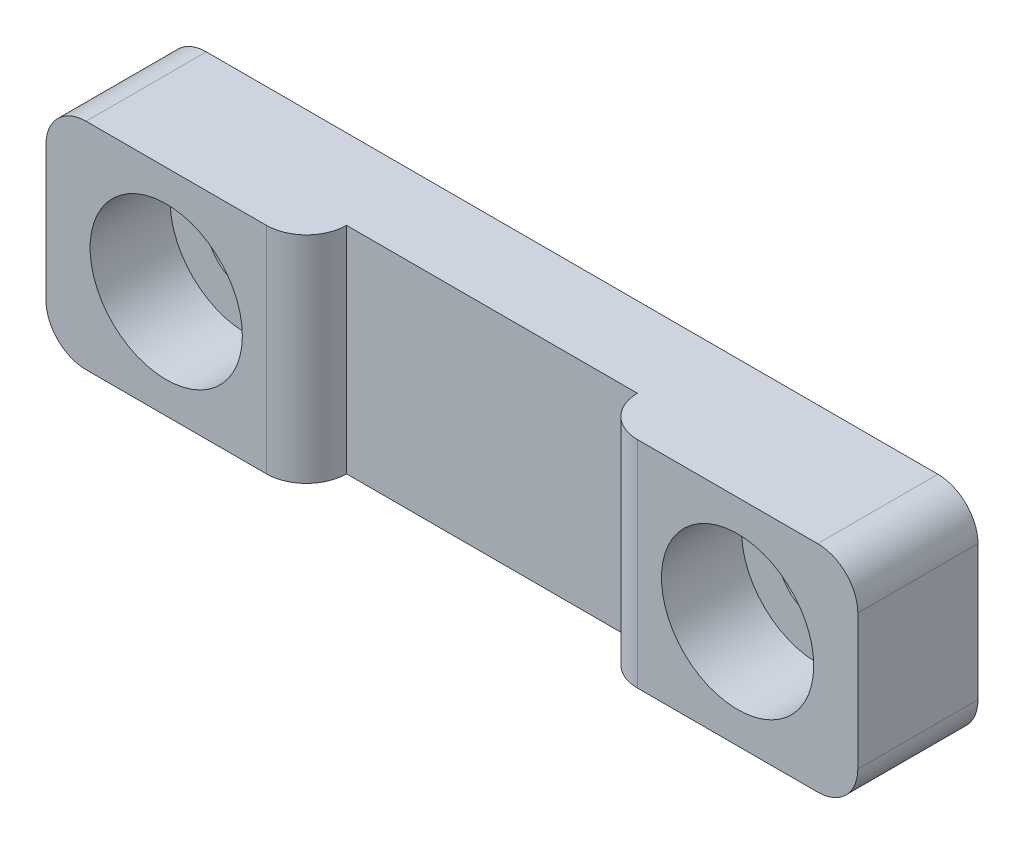
ISO-10303-21;
HEADER;
FILE_DESCRIPTION(('STEP AP214'),'2;1');
FILE_NAME('part.step','',(''),(''),'','','');
FILE_SCHEMA(('AUTOMOTIVE_DESIGN { 1 0 10303 214 1 1 1 1 }'));
ENDSEC;
DATA;
#1=APPLICATION_CONTEXT('core data for automotive mechanical design processes');
#2=APPLICATION_PROTOCOL_DEFINITION('international standard','automotive_design',2000,#1);
#3=PRODUCT_CONTEXT('',#1,'mechanical');
#4=PRODUCT('Part','Part','',(#3));
#5=PRODUCT_RELATED_PRODUCT_CATEGORY('part','',(#4));
#6=PRODUCT_DEFINITION_FORMATION('','',#4);
#7=PRODUCT_DEFINITION_CONTEXT('part definition',#1,'design');
#8=PRODUCT_DEFINITION('design','',#6,#7);
#9=PRODUCT_DEFINITION_SHAPE('','',#8);
#10=(LENGTH_UNIT() NAMED_UNIT(*) SI_UNIT(.MILLI.,.METRE.));
#11=(NAMED_UNIT(*) PLANE_ANGLE_UNIT() SI_UNIT($,.RADIAN.));
#12=(NAMED_UNIT(*) SI_UNIT($,.STERADIAN.) SOLID_ANGLE_UNIT());
#13=UNCERTAINTY_MEASURE_WITH_UNIT(LENGTH_MEASURE(1.E-05),#10,'distance_accuracy_value','');
#14=(GEOMETRIC_REPRESENTATION_CONTEXT(3) GLOBAL_UNCERTAINTY_ASSIGNED_CONTEXT((#13)) GLOBAL_UNIT_ASSIGNED_CONTEXT((#10,
#11,#12)) REPRESENTATION_CONTEXT('',''));
#15=CARTESIAN_POINT('',(0.,0.,0.));
#16=DIRECTION('',(0.,0.,1.));
#17=DIRECTION('',(1.,0.,0.));
#18=AXIS2_PLACEMENT_3D('',#15,#16,#17);
#19=CARTESIAN_POINT('',(19.26,1.,2.));
#20=DIRECTION('',(0.,0.,1.));
#21=DIRECTION('',(1.,0.,0.));
#22=AXIS2_PLACEMENT_3D('',#19,#20,#21);
#23=PLANE('',#22);
#24=DIRECTION('',(1.,0.,0.));
#25=VECTOR('',#24,1.);
#26=CARTESIAN_POINT('',(1.00000000000001,0.,2.));
#27=LINE('',#26,#25);
#28=CARTESIAN_POINT('',(1.00000000000001,0.,2.));
#29=VERTEX_POINT('',#28);
#30=CARTESIAN_POINT('',(5.5,0.,2.));
#31=VERTEX_POINT('',#30);
#32=EDGE_CURVE('E210',#29,#31,#27,.T.);
#33=ORIENTED_EDGE('',*,*,#32,.T.);
#34=DIRECTION('',(0.,-1.,0.));
#35=VECTOR('',#34,1.);
#36=CARTESIAN_POINT('',(5.5,5.371699928288,2.));
#37=LINE('',#36,#35);
#38=CARTESIAN_POINT('',(5.5,5.371699928288,2.));
#39=VERTEX_POINT('',#38);
#40=EDGE_CURVE('E11',#31,#39,#37,.F.);
#41=ORIENTED_EDGE('',*,*,#40,.T.);
#42=DIRECTION('',(-1.,0.,0.));
#43=VECTOR('',#42,1.);
#44=CARTESIAN_POINT('',(1.00000000000001,5.371699928288,2.));
#45=LINE('',#44,#43);
#46=CARTESIAN_POINT('',(1.00000000000001,5.371699928288,2.));
#47=VERTEX_POINT('',#46);
#48=EDGE_CURVE('E201',#39,#47,#45,.T.);
#49=ORIENTED_EDGE('',*,*,#48,.T.);
#50=CARTESIAN_POINT('',(1.,4.371699928288,2.));
#51=DIRECTION('',(0.,0.,1.));
#52=DIRECTION('',(-1.,0.,0.));
#53=AXIS2_PLACEMENT_3D('',#50,#51,#52);
#54=CIRCLE('',#53,1.);
#55=CARTESIAN_POINT('',(0.,4.37169992828799,2.));
#56=VERTEX_POINT('',#55);
#57=EDGE_CURVE('E204',#47,#56,#54,.T.);
#58=ORIENTED_EDGE('',*,*,#57,.T.);
#59=DIRECTION('',(0.,-1.,0.));
#60=VECTOR('',#59,1.);
#61=CARTESIAN_POINT('',(0.,1.00000000000001,2.));
#62=LINE('',#61,#60);
#63=CARTESIAN_POINT('',(0.,1.,2.));
#64=VERTEX_POINT('',#63);
#65=EDGE_CURVE('E206',#56,#64,#62,.T.);
#66=ORIENTED_EDGE('',*,*,#65,.T.);
#67=CARTESIAN_POINT('',(1.,1.,2.));
#68=DIRECTION('',(0.,0.,1.));
#69=DIRECTION('',(-1.,0.,0.));
#70=AXIS2_PLACEMENT_3D('',#67,#68,#69);
#71=CIRCLE('',#70,1.);
#72=EDGE_CURVE('E208',#64,#29,#71,.T.);
#73=ORIENTED_EDGE('',*,*,#72,.T.);
#74=EDGE_LOOP('',(#33,#41,#49,#58,#66,#73));
#75=FACE_BOUND('',#74,.T.);
#76=CARTESIAN_POINT('',(3.,2.685849964144,2.));
#77=DIRECTION('',(0.,0.,1.));
#78=DIRECTION('',(1.,0.,0.));
#79=AXIS2_PLACEMENT_3D('',#76,#77,#78);
#80=CIRCLE('',#79,1.9);
#81=CARTESIAN_POINT('',(4.9,2.685849964144,2.));
#82=VERTEX_POINT('',#81);
#83=EDGE_CURVE('E189',#82,#82,#80,.T.);
#84=ORIENTED_EDGE('',*,*,#83,.F.);
#85=EDGE_LOOP('',(#84));
#86=FACE_BOUND('',#85,.T.);
#87=ADVANCED_FACE('F34',(#75,#86),#23,.T.);
#88=CARTESIAN_POINT('',(19.26,5.371699928288,2.));
#89=VERTEX_POINT('',#88);
#90=CARTESIAN_POINT('',(14.76,5.371699928288,2.));
#91=VERTEX_POINT('',#90);
#92=EDGE_CURVE('E202',#89,#91,#45,.T.);
#93=ORIENTED_EDGE('',*,*,#92,.T.);
#94=DIRECTION('',(0.,1.,0.));
#95=VECTOR('',#94,1.);
#96=CARTESIAN_POINT('',(14.76,0.,2.));
#97=LINE('',#96,#95);
#98=CARTESIAN_POINT('',(14.76,0.,2.));
#99=VERTEX_POINT('',#98);
#100=EDGE_CURVE('E57',#91,#99,#97,.F.);
#101=ORIENTED_EDGE('',*,*,#100,.T.);
#102=CARTESIAN_POINT('',(19.26,0.,2.));
#103=VERTEX_POINT('',#102);
#104=EDGE_CURVE('E126',#99,#103,#27,.T.);
#105=ORIENTED_EDGE('',*,*,#104,.T.);
#106=CARTESIAN_POINT('',(19.26,1.,2.));
#107=DIRECTION('',(0.,0.,1.));
#108=DIRECTION('',(1.,0.,0.));
#109=AXIS2_PLACEMENT_3D('',#106,#107,#108);
#110=CIRCLE('',#109,1.);
#111=CARTESIAN_POINT('',(20.26,1.,2.));
#112=VERTEX_POINT('',#111);
#113=EDGE_CURVE('E192',#103,#112,#110,.T.);
#114=ORIENTED_EDGE('',*,*,#113,.T.);
#115=DIRECTION('',(0.,1.,0.));
#116=VECTOR('',#115,1.);
#117=CARTESIAN_POINT('',(20.26,1.,2.));
#118=LINE('',#117,#116);
#119=CARTESIAN_POINT('',(20.26,4.371699928288,2.));
#120=VERTEX_POINT('',#119);
#121=EDGE_CURVE('E197',#112,#120,#118,.T.);
#122=ORIENTED_EDGE('',*,*,#121,.T.);
#123=CARTESIAN_POINT('',(19.26,4.371699928288,2.));
#124=DIRECTION('',(0.,0.,1.));
#125=DIRECTION('',(-1.,0.,0.));
#126=AXIS2_PLACEMENT_3D('',#123,#124,#125);
#127=CIRCLE('',#126,1.);
#128=EDGE_CURVE('E199',#120,#89,#127,.T.);
#129=ORIENTED_EDGE('',*,*,#128,.T.);
#130=EDGE_LOOP('',(#93,#101,#105,#114,#122,#129));
#131=FACE_BOUND('',#130,.T.);
#132=CARTESIAN_POINT('',(17.26,2.685849964144,2.));
#133=DIRECTION('',(0.,0.,1.));
#134=DIRECTION('',(1.,0.,0.));
#135=AXIS2_PLACEMENT_3D('',#132,#133,#134);
#136=CIRCLE('',#135,1.9);
#137=CARTESIAN_POINT('',(19.16,2.685849964144,2.));
#138=VERTEX_POINT('',#137);
#139=EDGE_CURVE('E183',#138,#138,#136,.T.);
#140=ORIENTED_EDGE('',*,*,#139,.F.);
#141=EDGE_LOOP('',(#140));
#142=FACE_BOUND('',#141,.T.);
#143=ADVANCED_FACE('F235',(#131,#142),#23,.T.);
#144=CARTESIAN_POINT('',(19.26,1.,2.));
#145=DIRECTION('',(0.,0.,-1.));
#146=DIRECTION('',(-1.,0.,0.));
#147=AXIS2_PLACEMENT_3D('',#144,#145,#146);
#148=CYLINDRICAL_SURFACE('',#147,1.);
#149=DIRECTION('',(0.,0.,-1.));
#150=VECTOR('',#149,1.);
#151=CARTESIAN_POINT('',(19.26,0.,2.));
#152=LINE('',#151,#150);
#153=CARTESIAN_POINT('',(19.26,0.,-1.));
#154=VERTEX_POINT('',#153);
#155=EDGE_CURVE('E212',#103,#154,#152,.T.);
#156=ORIENTED_EDGE('',*,*,#155,.T.);
#157=CARTESIAN_POINT('',(19.26,1.,-1.));
#158=DIRECTION('',(0.,0.,-1.));
#159=DIRECTION('',(-1.,0.,0.));
#160=AXIS2_PLACEMENT_3D('',#157,#158,#159);
#161=CIRCLE('',#160,1.);
#162=CARTESIAN_POINT('',(20.26,1.,-1.));
#163=VERTEX_POINT('',#162);
#164=EDGE_CURVE('E156',#163,#154,#161,.T.);
#165=ORIENTED_EDGE('',*,*,#164,.F.);
#166=DIRECTION('',(0.,0.,-1.));
#167=VECTOR('',#166,1.);
#168=CARTESIAN_POINT('',(20.26,1.,2.));
#169=LINE('',#168,#167);
#170=EDGE_CURVE('E226',#112,#163,#169,.T.);
#171=ORIENTED_EDGE('',*,*,#170,.F.);
#172=ORIENTED_EDGE('',*,*,#113,.F.);
#173=EDGE_LOOP('',(#156,#165,#171,#172));
#174=FACE_BOUND('',#173,.T.);
#175=ADVANCED_FACE('F285',(#174),#148,.T.);
#176=CARTESIAN_POINT('',(20.26,1.,2.));
#177=DIRECTION('',(-1.,0.,0.));
#178=DIRECTION('',(0.,0.,1.));
#179=AXIS2_PLACEMENT_3D('',#176,#177,#178);
#180=PLANE('',#179);
#181=ORIENTED_EDGE('',*,*,#170,.T.);
#182=DIRECTION('',(0.,-1.,0.));
#183=VECTOR('',#182,1.);
#184=CARTESIAN_POINT('',(20.26,4.371699928288,-1.));
#185=LINE('',#184,#183);
#186=CARTESIAN_POINT('',(20.26,4.371699928288,-1.));
#187=VERTEX_POINT('',#186);
#188=EDGE_CURVE('E179',#187,#163,#185,.T.);
#189=ORIENTED_EDGE('',*,*,#188,.F.);
#190=DIRECTION('',(0.,0.,-1.));
#191=VECTOR('',#190,1.);
#192=CARTESIAN_POINT('',(20.26,4.371699928288,2.));
#193=LINE('',#192,#191);
#194=EDGE_CURVE('E224',#120,#187,#193,.T.);
#195=ORIENTED_EDGE('',*,*,#194,.F.);
#196=ORIENTED_EDGE('',*,*,#121,.F.);
#197=EDGE_LOOP('',(#181,#189,#195,#196));
#198=FACE_BOUND('',#197,.T.);
#199=ADVANCED_FACE('F335',(#198),#180,.F.);
#200=CARTESIAN_POINT('',(19.26,4.371699928288,2.));
#201=DIRECTION('',(0.,0.,-1.));
#202=DIRECTION('',(-1.,0.,0.));
#203=AXIS2_PLACEMENT_3D('',#200,#201,#202);
#204=CYLINDRICAL_SURFACE('',#203,1.);
#205=ORIENTED_EDGE('',*,*,#194,.T.);
#206=CARTESIAN_POINT('',(19.26,4.371699928288,-1.));
#207=DIRECTION('',(0.,0.,-1.));
#208=DIRECTION('',(-1.,0.,0.));
#209=AXIS2_PLACEMENT_3D('',#206,#207,#208);
#210=CIRCLE('',#209,1.);
#211=CARTESIAN_POINT('',(19.26,5.371699928288,-1.));
#212=VERTEX_POINT('',#211);
#213=EDGE_CURVE('E176',#212,#187,#210,.T.);
#214=ORIENTED_EDGE('',*,*,#213,.F.);
#215=DIRECTION('',(0.,0.,-1.));
#216=VECTOR('',#215,1.);
#217=CARTESIAN_POINT('',(19.26,5.371699928288,2.));
#218=LINE('',#217,#216);
#219=EDGE_CURVE('E222',#89,#212,#218,.T.);
#220=ORIENTED_EDGE('',*,*,#219,.F.);
#221=ORIENTED_EDGE('',*,*,#128,.F.);
#222=EDGE_LOOP('',(#205,#214,#220,#221));
#223=FACE_BOUND('',#222,.T.);
#224=ADVANCED_FACE('F242',(#223),#204,.T.);
#225=CARTESIAN_POINT('',(1.00000000000001,5.371699928288,2.));
#226=DIRECTION('',(0.,-1.,0.));
#227=DIRECTION('',(0.,0.,-1.));
#228=AXIS2_PLACEMENT_3D('',#225,#226,#227);
#229=PLANE('',#228);
#230=DIRECTION('',(1.,0.,0.));
#231=VECTOR('',#230,1.);
#232=CARTESIAN_POINT('',(1.00000000000001,5.371699928288,1.));
#233=LINE('',#232,#231);
#234=CARTESIAN_POINT('',(6.5,5.371699928288,1.));
#235=VERTEX_POINT('',#234);
#236=CARTESIAN_POINT('',(13.76,5.371699928288,1.));
#237=VERTEX_POINT('',#236);
#238=EDGE_CURVE('E141',#235,#237,#233,.T.);
#239=ORIENTED_EDGE('',*,*,#238,.T.);
#240=CARTESIAN_POINT('',(14.76,5.371699928288,1.));
#241=DIRECTION('',(0.,-1.,0.));
#242=DIRECTION('',(0.,0.,-1.));
#243=AXIS2_PLACEMENT_3D('',#240,#241,#242);
#244=CIRCLE('',#243,1.);
#245=EDGE_CURVE('E140',#237,#91,#244,.F.);
#246=ORIENTED_EDGE('',*,*,#245,.T.);
#247=ORIENTED_EDGE('',*,*,#92,.F.);
#248=ORIENTED_EDGE('',*,*,#219,.T.);
#249=DIRECTION('',(1.,0.,0.));
#250=VECTOR('',#249,1.);
#251=CARTESIAN_POINT('',(1.00000000000001,5.371699928288,-1.));
#252=LINE('',#251,#250);
#253=CARTESIAN_POINT('',(1.00000000000001,5.371699928288,-1.));
#254=VERTEX_POINT('',#253);
#255=EDGE_CURVE('E173',#254,#212,#252,.T.);
#256=ORIENTED_EDGE('',*,*,#255,.F.);
#257=DIRECTION('',(0.,0.,-1.));
#258=VECTOR('',#257,1.);
#259=CARTESIAN_POINT('',(1.00000000000001,5.371699928288,2.));
#260=LINE('',#259,#258);
#261=EDGE_CURVE('E220',#47,#254,#260,.T.);
#262=ORIENTED_EDGE('',*,*,#261,.F.);
#263=ORIENTED_EDGE('',*,*,#48,.F.);
#264=CARTESIAN_POINT('',(5.5,5.371699928288,1.));
#265=DIRECTION('',(0.,-1.,0.));
#266=DIRECTION('',(0.,0.,-1.));
#267=AXIS2_PLACEMENT_3D('',#264,#265,#266);
#268=CIRCLE('',#267,1.);
#269=EDGE_CURVE('E228',#39,#235,#268,.F.);
#270=ORIENTED_EDGE('',*,*,#269,.T.);
#271=EDGE_LOOP('',(#239,#246,#247,#248,#256,#262,#263,#270));
#272=FACE_BOUND('',#271,.T.);
#273=ADVANCED_FACE('F234',(#272),#229,.F.);
#274=CARTESIAN_POINT('',(1.,4.371699928288,2.));
#275=DIRECTION('',(0.,0.,-1.));
#276=DIRECTION('',(-1.,0.,0.));
#277=AXIS2_PLACEMENT_3D('',#274,#275,#276);
#278=CYLINDRICAL_SURFACE('',#277,1.);
#279=ORIENTED_EDGE('',*,*,#261,.T.);
#280=CARTESIAN_POINT('',(1.,4.371699928288,-1.));
#281=DIRECTION('',(0.,0.,-1.));
#282=DIRECTION('',(-1.,0.,0.));
#283=AXIS2_PLACEMENT_3D('',#280,#281,#282);
#284=CIRCLE('',#283,1.);
#285=CARTESIAN_POINT('',(0.,4.37169992828799,-1.));
#286=VERTEX_POINT('',#285);
#287=EDGE_CURVE('E170',#286,#254,#284,.T.);
#288=ORIENTED_EDGE('',*,*,#287,.F.);
#289=DIRECTION('',(0.,0.,-1.));
#290=VECTOR('',#289,1.);
#291=CARTESIAN_POINT('',(0.,4.37169992828799,2.));
#292=LINE('',#291,#290);
#293=EDGE_CURVE('E218',#56,#286,#292,.T.);
#294=ORIENTED_EDGE('',*,*,#293,.F.);
#295=ORIENTED_EDGE('',*,*,#57,.F.);
#296=EDGE_LOOP('',(#279,#288,#294,#295));
#297=FACE_BOUND('',#296,.T.);
#298=ADVANCED_FACE('F253',(#297),#278,.T.);
#299=CARTESIAN_POINT('',(0.,1.00000000000001,2.));
#300=DIRECTION('',(1.,0.,0.));
#301=DIRECTION('',(0.,0.,-1.));
#302=AXIS2_PLACEMENT_3D('',#299,#300,#301);
#303=PLANE('',#302);
#304=ORIENTED_EDGE('',*,*,#293,.T.);
#305=DIRECTION('',(0.,1.,0.));
#306=VECTOR('',#305,1.);
#307=CARTESIAN_POINT('',(0.,1.,-1.));
#308=LINE('',#307,#306);
#309=CARTESIAN_POINT('',(0.,1.,-1.));
#310=VERTEX_POINT('',#309);
#311=EDGE_CURVE('E167',#310,#286,#308,.T.);
#312=ORIENTED_EDGE('',*,*,#311,.F.);
#313=DIRECTION('',(0.,0.,-1.));
#314=VECTOR('',#313,1.);
#315=CARTESIAN_POINT('',(0.,1.,2.));
#316=LINE('',#315,#314);
#317=EDGE_CURVE('E216',#64,#310,#316,.T.);
#318=ORIENTED_EDGE('',*,*,#317,.F.);
#319=ORIENTED_EDGE('',*,*,#65,.F.);
#320=EDGE_LOOP('',(#304,#312,#318,#319));
#321=FACE_BOUND('',#320,.T.);
#322=ADVANCED_FACE('F271',(#321),#303,.F.);
#323=CARTESIAN_POINT('',(1.,1.,2.));
#324=DIRECTION('',(0.,0.,-1.));
#325=DIRECTION('',(-1.,0.,0.));
#326=AXIS2_PLACEMENT_3D('',#323,#324,#325);
#327=CYLINDRICAL_SURFACE('',#326,1.);
#328=ORIENTED_EDGE('',*,*,#317,.T.);
#329=CARTESIAN_POINT('',(1.,1.,-1.));
#330=DIRECTION('',(0.,0.,-1.));
#331=DIRECTION('',(-1.,0.,0.));
#332=AXIS2_PLACEMENT_3D('',#329,#330,#331);
#333=CIRCLE('',#332,1.);
#334=CARTESIAN_POINT('',(1.00000000000001,0.,-1.));
#335=VERTEX_POINT('',#334);
#336=EDGE_CURVE('E164',#335,#310,#333,.T.);
#337=ORIENTED_EDGE('',*,*,#336,.F.);
#338=DIRECTION('',(0.,0.,-1.));
#339=VECTOR('',#338,1.);
#340=CARTESIAN_POINT('',(1.00000000000001,0.,2.));
#341=LINE('',#340,#339);
#342=EDGE_CURVE('E214',#29,#335,#341,.T.);
#343=ORIENTED_EDGE('',*,*,#342,.F.);
#344=ORIENTED_EDGE('',*,*,#72,.F.);
#345=EDGE_LOOP('',(#328,#337,#343,#344));
#346=FACE_BOUND('',#345,.T.);
#347=ADVANCED_FACE('F268',(#346),#327,.T.);
#348=CARTESIAN_POINT('',(1.00000000000001,0.,2.));
#349=DIRECTION('',(0.,1.,0.));
#350=DIRECTION('',(0.,0.,1.));
#351=AXIS2_PLACEMENT_3D('',#348,#349,#350);
#352=PLANE('',#351);
#353=ORIENTED_EDGE('',*,*,#104,.F.);
#354=CARTESIAN_POINT('',(14.76,0.,1.));
#355=DIRECTION('',(0.,1.,0.));
#356=DIRECTION('',(0.,0.,1.));
#357=AXIS2_PLACEMENT_3D('',#354,#355,#356);
#358=CIRCLE('',#357,1.);
#359=CARTESIAN_POINT('',(13.76,0.,1.));
#360=VERTEX_POINT('',#359);
#361=EDGE_CURVE('E42',#99,#360,#358,.F.);
#362=ORIENTED_EDGE('',*,*,#361,.T.);
#363=DIRECTION('',(1.,0.,0.));
#364=VECTOR('',#363,1.);
#365=CARTESIAN_POINT('',(6.5,0.,1.));
#366=LINE('',#365,#364);
#367=CARTESIAN_POINT('',(6.5,0.,1.));
#368=VERTEX_POINT('',#367);
#369=EDGE_CURVE('E124',#368,#360,#366,.T.);
#370=ORIENTED_EDGE('',*,*,#369,.F.);
#371=CARTESIAN_POINT('',(5.5,0.,1.));
#372=DIRECTION('',(0.,1.,0.));
#373=DIRECTION('',(0.,0.,1.));
#374=AXIS2_PLACEMENT_3D('',#371,#372,#373);
#375=CIRCLE('',#374,1.);
#376=EDGE_CURVE('E49',#368,#31,#375,.F.);
#377=ORIENTED_EDGE('',*,*,#376,.T.);
#378=ORIENTED_EDGE('',*,*,#32,.F.);
#379=ORIENTED_EDGE('',*,*,#342,.T.);
#380=DIRECTION('',(-1.,0.,0.));
#381=VECTOR('',#380,1.);
#382=CARTESIAN_POINT('',(19.26,0.,-1.));
#383=LINE('',#382,#381);
#384=EDGE_CURVE('E161',#154,#335,#383,.T.);
#385=ORIENTED_EDGE('',*,*,#384,.F.);
#386=ORIENTED_EDGE('',*,*,#155,.F.);
#387=EDGE_LOOP('',(#353,#362,#370,#377,#378,#379,#385,#386));
#388=FACE_BOUND('',#387,.T.);
#389=ADVANCED_FACE('F123',(#388),#352,.F.);
#390=CARTESIAN_POINT('',(3.,2.685849964144,2.));
#391=DIRECTION('',(0.,0.,-1.));
#392=DIRECTION('',(-1.,0.,0.));
#393=AXIS2_PLACEMENT_3D('',#390,#391,#392);
#394=CYLINDRICAL_SURFACE('',#393,1.9);
#395=ORIENTED_EDGE('',*,*,#83,.T.);
#396=EDGE_LOOP('',(#395));
#397=FACE_BOUND('',#396,.T.);
#398=CARTESIAN_POINT('',(3.,2.685849964144,0.));
#399=DIRECTION('',(0.,0.,1.));
#400=DIRECTION('',(1.,0.,0.));
#401=AXIS2_PLACEMENT_3D('',#398,#399,#400);
#402=CIRCLE('',#401,1.9);
#403=CARTESIAN_POINT('',(4.9,2.685849964144,0.));
#404=VERTEX_POINT('',#403);
#405=EDGE_CURVE('E186',#404,#404,#402,.T.);
#406=ORIENTED_EDGE('',*,*,#405,.F.);
#407=EDGE_LOOP('',(#406));
#408=FACE_BOUND('',#407,.T.);
#409=ADVANCED_FACE('F288',(#397,#408),#394,.F.);
#410=CARTESIAN_POINT('',(17.26,2.685849964144,2.));
#411=DIRECTION('',(0.,0.,-1.));
#412=DIRECTION('',(-1.,0.,0.));
#413=AXIS2_PLACEMENT_3D('',#410,#411,#412);
#414=CYLINDRICAL_SURFACE('',#413,1.9);
#415=ORIENTED_EDGE('',*,*,#139,.T.);
#416=EDGE_LOOP('',(#415));
#417=FACE_BOUND('',#416,.T.);
#418=CARTESIAN_POINT('',(17.26,2.685849964144,0.));
#419=DIRECTION('',(0.,0.,1.));
#420=DIRECTION('',(1.,0.,0.));
#421=AXIS2_PLACEMENT_3D('',#418,#419,#420);
#422=CIRCLE('',#421,1.9);
#423=CARTESIAN_POINT('',(19.16,2.685849964144,0.));
#424=VERTEX_POINT('',#423);
#425=EDGE_CURVE('E182',#424,#424,#422,.T.);
#426=ORIENTED_EDGE('',*,*,#425,.F.);
#427=EDGE_LOOP('',(#426));
#428=FACE_BOUND('',#427,.T.);
#429=ADVANCED_FACE('F294',(#417,#428),#414,.F.);
#430=CARTESIAN_POINT('',(19.26,1.,0.));
#431=DIRECTION('',(0.,0.,-1.));
#432=DIRECTION('',(-1.,0.,0.));
#433=AXIS2_PLACEMENT_3D('',#430,#431,#432);
#434=PLANE('',#433);
#435=CARTESIAN_POINT('',(3.,2.685849964144,0.));
#436=DIRECTION('',(0.,0.,-1.));
#437=DIRECTION('',(-1.,0.,0.));
#438=AXIS2_PLACEMENT_3D('',#435,#436,#437);
#439=CIRCLE('',#438,1.);
#440=CARTESIAN_POINT('',(2.,2.685849964144,0.));
#441=VERTEX_POINT('',#440);
#442=EDGE_CURVE('E143',#441,#441,#439,.T.);
#443=ORIENTED_EDGE('',*,*,#442,.T.);
#444=EDGE_LOOP('',(#443));
#445=FACE_BOUND('',#444,.T.);
#446=ORIENTED_EDGE('',*,*,#405,.T.);
#447=EDGE_LOOP('',(#446));
#448=FACE_BOUND('',#447,.T.);
#449=ADVANCED_FACE('F299',(#445,#448),#434,.F.);
#450=CARTESIAN_POINT('',(17.26,2.685849964144,0.));
#451=DIRECTION('',(0.,0.,-1.));
#452=DIRECTION('',(-1.,0.,0.));
#453=AXIS2_PLACEMENT_3D('',#450,#451,#452);
#454=CIRCLE('',#453,1.);
#455=CARTESIAN_POINT('',(16.26,2.685849964144,0.));
#456=VERTEX_POINT('',#455);
#457=EDGE_CURVE('E150',#456,#456,#454,.T.);
#458=ORIENTED_EDGE('',*,*,#457,.T.);
#459=EDGE_LOOP('',(#458));
#460=FACE_BOUND('',#459,.T.);
#461=ORIENTED_EDGE('',*,*,#425,.T.);
#462=EDGE_LOOP('',(#461));
#463=FACE_BOUND('',#462,.T.);
#464=ADVANCED_FACE('F306',(#460,#463),#434,.F.);
#465=CARTESIAN_POINT('',(19.26,1.,-1.));
#466=DIRECTION('',(0.,0.,-1.));
#467=DIRECTION('',(-1.,0.,0.));
#468=AXIS2_PLACEMENT_3D('',#465,#466,#467);
#469=PLANE('',#468);
#470=CARTESIAN_POINT('',(17.26,2.685849964144,-1.));
#471=DIRECTION('',(0.,0.,-1.));
#472=DIRECTION('',(-1.,0.,0.));
#473=AXIS2_PLACEMENT_3D('',#470,#471,#472);
#474=CIRCLE('',#473,1.);
#475=CARTESIAN_POINT('',(16.26,2.685849964144,-1.));
#476=VERTEX_POINT('',#475);
#477=EDGE_CURVE('E153',#476,#476,#474,.T.);
#478=ORIENTED_EDGE('',*,*,#477,.F.);
#479=EDGE_LOOP('',(#478));
#480=FACE_BOUND('',#479,.T.);
#481=ORIENTED_EDGE('',*,*,#164,.T.);
#482=ORIENTED_EDGE('',*,*,#384,.T.);
#483=ORIENTED_EDGE('',*,*,#336,.T.);
#484=ORIENTED_EDGE('',*,*,#311,.T.);
#485=ORIENTED_EDGE('',*,*,#287,.T.);
#486=ORIENTED_EDGE('',*,*,#255,.T.);
#487=ORIENTED_EDGE('',*,*,#213,.T.);
#488=ORIENTED_EDGE('',*,*,#188,.T.);
#489=EDGE_LOOP('',(#481,#482,#483,#484,#485,#486,#487,#488));
#490=FACE_BOUND('',#489,.T.);
#491=CARTESIAN_POINT('',(3.,2.685849964144,-1.));
#492=DIRECTION('',(0.,0.,-1.));
#493=DIRECTION('',(-1.,0.,0.));
#494=AXIS2_PLACEMENT_3D('',#491,#492,#493);
#495=CIRCLE('',#494,1.);
#496=CARTESIAN_POINT('',(2.,2.685849964144,-1.));
#497=VERTEX_POINT('',#496);
#498=EDGE_CURVE('E147',#497,#497,#495,.T.);
#499=ORIENTED_EDGE('',*,*,#498,.F.);
#500=EDGE_LOOP('',(#499));
#501=FACE_BOUND('',#500,.T.);
#502=ADVANCED_FACE('F246',(#480,#490,#501),#469,.T.);
#503=CARTESIAN_POINT('',(17.26,2.685849964144,-1.));
#504=DIRECTION('',(0.,0.,1.));
#505=DIRECTION('',(1.,0.,0.));
#506=AXIS2_PLACEMENT_3D('',#503,#504,#505);
#507=CYLINDRICAL_SURFACE('',#506,1.);
#508=ORIENTED_EDGE('',*,*,#477,.T.);
#509=EDGE_LOOP('',(#508));
#510=FACE_BOUND('',#509,.T.);
#511=ORIENTED_EDGE('',*,*,#457,.F.);
#512=EDGE_LOOP('',(#511));
#513=FACE_BOUND('',#512,.T.);
#514=ADVANCED_FACE('F316',(#510,#513),#507,.F.);
#515=CARTESIAN_POINT('',(3.,2.685849964144,-1.));
#516=DIRECTION('',(0.,0.,1.));
#517=DIRECTION('',(1.,0.,0.));
#518=AXIS2_PLACEMENT_3D('',#515,#516,#517);
#519=CYLINDRICAL_SURFACE('',#518,1.);
#520=ORIENTED_EDGE('',*,*,#498,.T.);
#521=EDGE_LOOP('',(#520));
#522=FACE_BOUND('',#521,.T.);
#523=ORIENTED_EDGE('',*,*,#442,.F.);
#524=EDGE_LOOP('',(#523));
#525=FACE_BOUND('',#524,.T.);
#526=ADVANCED_FACE('F320',(#522,#525),#519,.F.);
#527=CARTESIAN_POINT('',(6.5,10.,1.));
#528=DIRECTION('',(0.,0.,-1.));
#529=DIRECTION('',(-1.,0.,0.));
#530=AXIS2_PLACEMENT_3D('',#527,#528,#529);
#531=PLANE('',#530);
#532=DIRECTION('',(0.,-1.,0.));
#533=VECTOR('',#532,1.);
#534=CARTESIAN_POINT('',(6.5,10.,1.));
#535=LINE('',#534,#533);
#536=EDGE_CURVE('E137',#235,#368,#535,.T.);
#537=ORIENTED_EDGE('',*,*,#536,.T.);
#538=ORIENTED_EDGE('',*,*,#369,.T.);
#539=DIRECTION('',(0.,-1.,0.));
#540=VECTOR('',#539,1.);
#541=CARTESIAN_POINT('',(13.76,10.,1.));
#542=LINE('',#541,#540);
#543=EDGE_CURVE('E134',#237,#360,#542,.T.);
#544=ORIENTED_EDGE('',*,*,#543,.F.);
#545=ORIENTED_EDGE('',*,*,#238,.F.);
#546=EDGE_LOOP('',(#537,#538,#544,#545));
#547=FACE_BOUND('',#546,.T.);
#548=ADVANCED_FACE('F132',(#547),#531,.F.);
#549=CARTESIAN_POINT('',(14.76,10.,1.));
#550=DIRECTION('',(0.,-1.,0.));
#551=DIRECTION('',(0.,0.,-1.));
#552=AXIS2_PLACEMENT_3D('',#549,#550,#551);
#553=CYLINDRICAL_SURFACE('',#552,1.);
#554=ORIENTED_EDGE('',*,*,#361,.F.);
#555=ORIENTED_EDGE('',*,*,#100,.F.);
#556=ORIENTED_EDGE('',*,*,#245,.F.);
#557=ORIENTED_EDGE('',*,*,#543,.T.);
#558=EDGE_LOOP('',(#554,#555,#556,#557));
#559=FACE_BOUND('',#558,.T.);
#560=ADVANCED_FACE('F139',(#559),#553,.T.);
#561=CARTESIAN_POINT('',(5.5,10.,1.));
#562=DIRECTION('',(0.,1.,0.));
#563=DIRECTION('',(0.,0.,1.));
#564=AXIS2_PLACEMENT_3D('',#561,#562,#563);
#565=CYLINDRICAL_SURFACE('',#564,1.);
#566=ORIENTED_EDGE('',*,*,#269,.F.);
#567=ORIENTED_EDGE('',*,*,#40,.F.);
#568=ORIENTED_EDGE('',*,*,#376,.F.);
#569=ORIENTED_EDGE('',*,*,#536,.F.);
#570=EDGE_LOOP('',(#566,#567,#568,#569));
#571=FACE_BOUND('',#570,.T.);
#572=ADVANCED_FACE('F36',(#571),#565,.T.);
#573=CLOSED_SHELL('',(#87,#143,#175,#199,#224,#273,#298,#322,#347,#389,#409,#429,#449,#464,#502,
#514,#526,#548,#560,#572));
#574=MANIFOLD_SOLID_BREP('B2',#573);
#575=ADVANCED_BREP_SHAPE_REPRESENTATION('',(#18,#574),#14);
#576=SHAPE_DEFINITION_REPRESENTATION(#9,#575);
ENDSEC;
END-ISO-10303-21;
